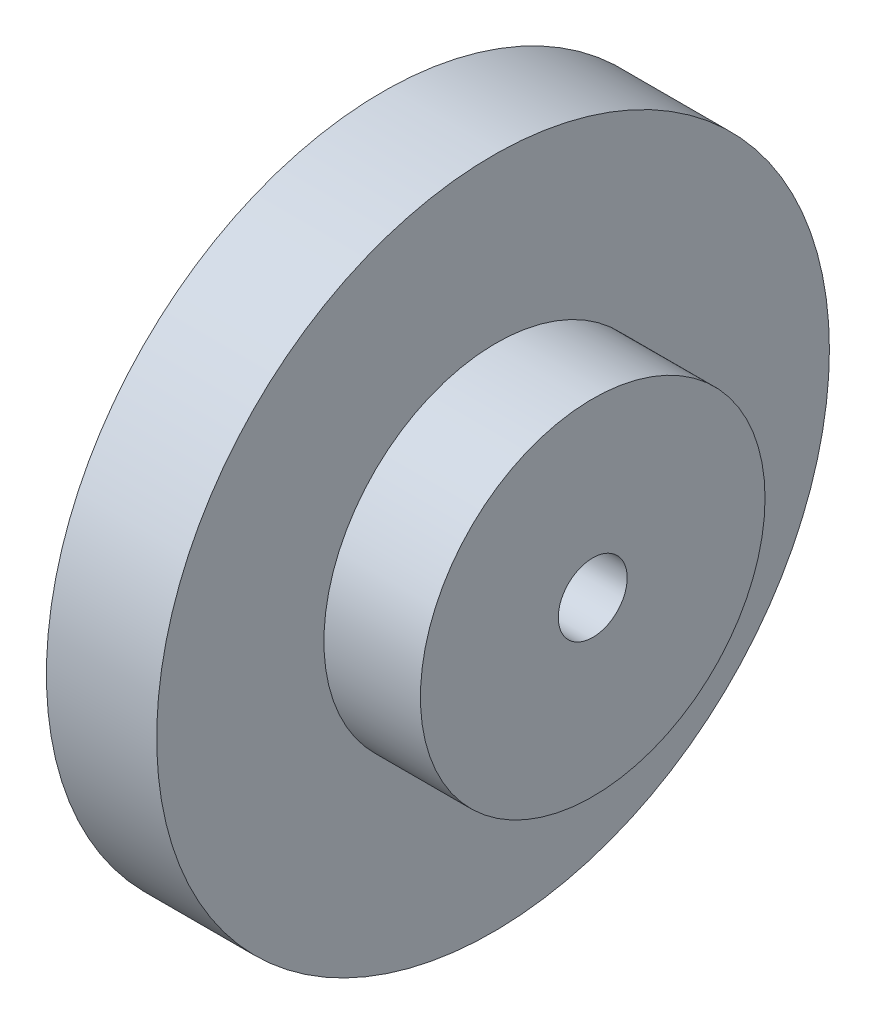
ISO-10303-21;
HEADER;
FILE_DESCRIPTION(('STEP AP214'),'2;1');
FILE_NAME('part.step','',(''),(''),'','','');
FILE_SCHEMA(('AUTOMOTIVE_DESIGN { 1 0 10303 214 1 1 1 1 }'));
ENDSEC;
DATA;
#1=APPLICATION_CONTEXT('core data for automotive mechanical design processes');
#2=APPLICATION_PROTOCOL_DEFINITION('international standard','automotive_design',2000,#1);
#3=PRODUCT_CONTEXT('',#1,'mechanical');
#4=PRODUCT('Part','Part','',(#3));
#5=PRODUCT_RELATED_PRODUCT_CATEGORY('part','',(#4));
#6=PRODUCT_DEFINITION_FORMATION('','',#4);
#7=PRODUCT_DEFINITION_CONTEXT('part definition',#1,'design');
#8=PRODUCT_DEFINITION('design','',#6,#7);
#9=PRODUCT_DEFINITION_SHAPE('','',#8);
#10=(LENGTH_UNIT() NAMED_UNIT(*) SI_UNIT(.MILLI.,.METRE.));
#11=(NAMED_UNIT(*) PLANE_ANGLE_UNIT() SI_UNIT($,.RADIAN.));
#12=(NAMED_UNIT(*) SI_UNIT($,.STERADIAN.) SOLID_ANGLE_UNIT());
#13=UNCERTAINTY_MEASURE_WITH_UNIT(LENGTH_MEASURE(1.E-05),#10,'distance_accuracy_value','');
#14=(GEOMETRIC_REPRESENTATION_CONTEXT(3) GLOBAL_UNCERTAINTY_ASSIGNED_CONTEXT((#13)) GLOBAL_UNIT_ASSIGNED_CONTEXT((#10,
#11,#12)) REPRESENTATION_CONTEXT('',''));
#15=CARTESIAN_POINT('',(0.,0.,0.));
#16=DIRECTION('',(0.,0.,1.));
#17=DIRECTION('',(1.,0.,0.));
#18=AXIS2_PLACEMENT_3D('',#15,#16,#17);
#19=CARTESIAN_POINT('',(8.,-0.19719948959146,0.));
#20=DIRECTION('',(1.,0.,0.));
#21=DIRECTION('',(0.,0.,-1.));
#22=AXIS2_PLACEMENT_3D('',#19,#20,#21);
#23=PLANE('',#22);
#24=CARTESIAN_POINT('',(8.,-0.19719948959146,0.));
#25=DIRECTION('',(1.,0.,0.));
#26=DIRECTION('',(0.,0.,-1.));
#27=AXIS2_PLACEMENT_3D('',#24,#25,#26);
#28=CIRCLE('',#27,24.4);
#29=CARTESIAN_POINT('',(8.,-0.19719948959146,-24.4));
#30=VERTEX_POINT('',#29);
#31=EDGE_CURVE('E10',#30,#30,#28,.T.);
#32=ORIENTED_EDGE('',*,*,#31,.T.);
#33=EDGE_LOOP('',(#32));
#34=FACE_BOUND('',#33,.T.);
#35=CARTESIAN_POINT('',(8.,-0.19719948959146,-0.230786773613545));
#36=DIRECTION('',(1.,0.,0.));
#37=DIRECTION('',(0.,0.,-1.));
#38=AXIS2_PLACEMENT_3D('',#35,#36,#37);
#39=CIRCLE('',#38,12.5);
#40=CARTESIAN_POINT('',(8.,-0.19719948959146,-12.7307867736135));
#41=VERTEX_POINT('',#40);
#42=EDGE_CURVE('E47',#41,#41,#39,.T.);
#43=ORIENTED_EDGE('',*,*,#42,.F.);
#44=EDGE_LOOP('',(#43));
#45=FACE_BOUND('',#44,.T.);
#46=ADVANCED_FACE('F31',(#34,#45),#23,.T.);
#47=CARTESIAN_POINT('',(0.,-0.19719948959146,0.));
#48=DIRECTION('',(1.,0.,0.));
#49=DIRECTION('',(0.,0.,-1.));
#50=AXIS2_PLACEMENT_3D('',#47,#48,#49);
#51=PLANE('',#50);
#52=CARTESIAN_POINT('',(0.,-0.19719948959146,0.));
#53=DIRECTION('',(1.,0.,0.));
#54=DIRECTION('',(0.,0.,-1.));
#55=AXIS2_PLACEMENT_3D('',#52,#53,#54);
#56=CIRCLE('',#55,24.4);
#57=CARTESIAN_POINT('',(0.,-0.19719948959146,-24.4));
#58=VERTEX_POINT('',#57);
#59=EDGE_CURVE('E35',#58,#58,#56,.T.);
#60=ORIENTED_EDGE('',*,*,#59,.F.);
#61=EDGE_LOOP('',(#60));
#62=FACE_BOUND('',#61,.T.);
#63=CARTESIAN_POINT('',(0.,-0.19719948959146,-0.230786773613545));
#64=DIRECTION('',(1.,0.,0.));
#65=DIRECTION('',(0.,0.,-1.));
#66=AXIS2_PLACEMENT_3D('',#63,#64,#65);
#67=CIRCLE('',#66,2.5);
#68=CARTESIAN_POINT('',(0.,-0.19719948959146,-2.73078677361354));
#69=VERTEX_POINT('',#68);
#70=EDGE_CURVE('E42',#69,#69,#67,.T.);
#71=ORIENTED_EDGE('',*,*,#70,.T.);
#72=EDGE_LOOP('',(#71));
#73=FACE_BOUND('',#72,.T.);
#74=ADVANCED_FACE('F72',(#62,#73),#51,.F.);
#75=CARTESIAN_POINT('',(8.,-0.19719948959146,0.));
#76=DIRECTION('',(-1.,0.,0.));
#77=DIRECTION('',(0.,0.,1.));
#78=AXIS2_PLACEMENT_3D('',#75,#76,#77);
#79=CYLINDRICAL_SURFACE('',#78,24.4);
#80=ORIENTED_EDGE('',*,*,#31,.F.);
#81=EDGE_LOOP('',(#80));
#82=FACE_BOUND('',#81,.T.);
#83=ORIENTED_EDGE('',*,*,#59,.T.);
#84=EDGE_LOOP('',(#83));
#85=FACE_BOUND('',#84,.T.);
#86=ADVANCED_FACE('F33',(#82,#85),#79,.T.);
#87=CARTESIAN_POINT('',(8.,-0.19719948959146,-0.230786773613545));
#88=DIRECTION('',(-1.,0.,0.));
#89=DIRECTION('',(0.,0.,1.));
#90=AXIS2_PLACEMENT_3D('',#87,#88,#89);
#91=CYLINDRICAL_SURFACE('',#90,2.5);
#92=ORIENTED_EDGE('',*,*,#70,.F.);
#93=EDGE_LOOP('',(#92));
#94=FACE_BOUND('',#93,.T.);
#95=CARTESIAN_POINT('',(15.,-0.19719948959146,-0.230786773613545));
#96=DIRECTION('',(1.,0.,0.));
#97=DIRECTION('',(0.,0.,-1.));
#98=AXIS2_PLACEMENT_3D('',#95,#96,#97);
#99=CIRCLE('',#98,2.5);
#100=CARTESIAN_POINT('',(15.,-0.19719948959146,-2.73078677361354));
#101=VERTEX_POINT('',#100);
#102=EDGE_CURVE('E50',#101,#101,#99,.T.);
#103=ORIENTED_EDGE('',*,*,#102,.T.);
#104=EDGE_LOOP('',(#103));
#105=FACE_BOUND('',#104,.T.);
#106=ADVANCED_FACE('F56',(#94,#105),#91,.F.);
#107=CARTESIAN_POINT('',(15.,-0.19719948959146,-0.230786773613545));
#108=DIRECTION('',(1.,0.,0.));
#109=DIRECTION('',(0.,0.,-1.));
#110=AXIS2_PLACEMENT_3D('',#107,#108,#109);
#111=PLANE('',#110);
#112=CARTESIAN_POINT('',(15.,-0.19719948959146,-0.230786773613545));
#113=DIRECTION('',(1.,0.,0.));
#114=DIRECTION('',(0.,0.,-1.));
#115=AXIS2_PLACEMENT_3D('',#112,#113,#114);
#116=CIRCLE('',#115,12.5);
#117=CARTESIAN_POINT('',(15.,-0.19719948959146,-12.7307867736135));
#118=VERTEX_POINT('',#117);
#119=EDGE_CURVE('E46',#118,#118,#116,.T.);
#120=ORIENTED_EDGE('',*,*,#119,.T.);
#121=EDGE_LOOP('',(#120));
#122=FACE_BOUND('',#121,.T.);
#123=ORIENTED_EDGE('',*,*,#102,.F.);
#124=EDGE_LOOP('',(#123));
#125=FACE_BOUND('',#124,.T.);
#126=ADVANCED_FACE('F58',(#122,#125),#111,.T.);
#127=CARTESIAN_POINT('',(15.,-0.19719948959146,-0.230786773613545));
#128=DIRECTION('',(-1.,0.,0.));
#129=DIRECTION('',(0.,0.,1.));
#130=AXIS2_PLACEMENT_3D('',#127,#128,#129);
#131=CYLINDRICAL_SURFACE('',#130,12.5);
#132=ORIENTED_EDGE('',*,*,#119,.F.);
#133=EDGE_LOOP('',(#132));
#134=FACE_BOUND('',#133,.T.);
#135=ORIENTED_EDGE('',*,*,#42,.T.);
#136=EDGE_LOOP('',(#135));
#137=FACE_BOUND('',#136,.T.);
#138=ADVANCED_FACE('F60',(#134,#137),#131,.T.);
#139=CLOSED_SHELL('',(#46,#74,#86,#106,#126,#138));
#140=MANIFOLD_SOLID_BREP('B2',#139);
#141=ADVANCED_BREP_SHAPE_REPRESENTATION('',(#18,#140),#14);
#142=SHAPE_DEFINITION_REPRESENTATION(#9,#141);
ENDSEC;
END-ISO-10303-21;
